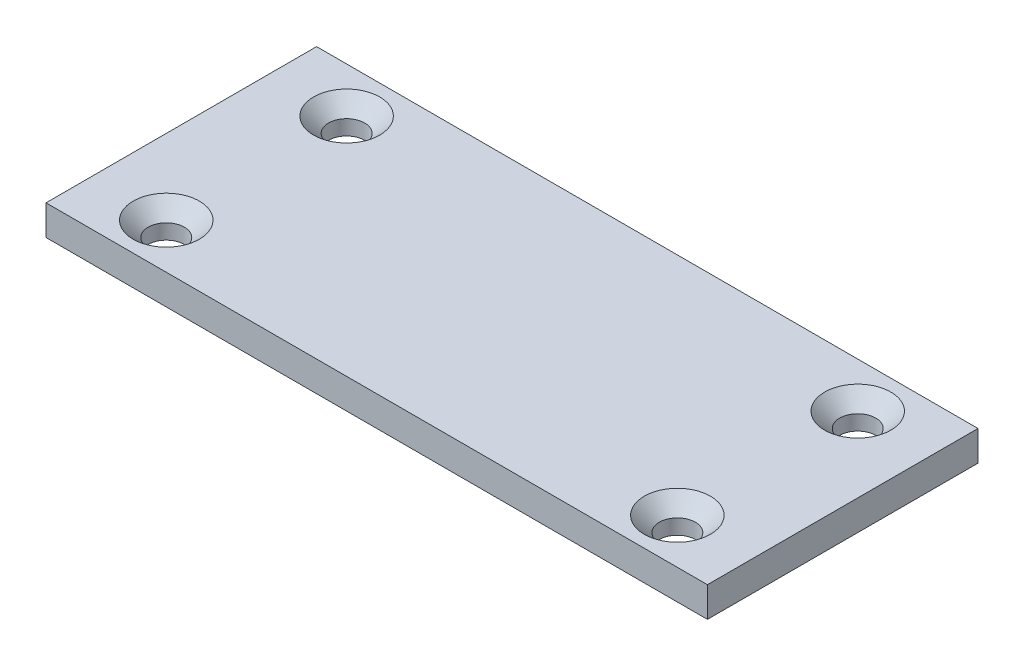
ISO-10303-21;
HEADER;
FILE_DESCRIPTION(('STEP AP214'),'2;1');
FILE_NAME('part.step','',(''),(''),'','','');
FILE_SCHEMA(('AUTOMOTIVE_DESIGN { 1 0 10303 214 1 1 1 1 }'));
ENDSEC;
DATA;
#1=APPLICATION_CONTEXT('core data for automotive mechanical design processes');
#2=APPLICATION_PROTOCOL_DEFINITION('international standard','automotive_design',2000,#1);
#3=PRODUCT_CONTEXT('',#1,'mechanical');
#4=PRODUCT('Part','Part','',(#3));
#5=PRODUCT_RELATED_PRODUCT_CATEGORY('part','',(#4));
#6=PRODUCT_DEFINITION_FORMATION('','',#4);
#7=PRODUCT_DEFINITION_CONTEXT('part definition',#1,'design');
#8=PRODUCT_DEFINITION('design','',#6,#7);
#9=PRODUCT_DEFINITION_SHAPE('','',#8);
#10=(LENGTH_UNIT() NAMED_UNIT(*) SI_UNIT(.MILLI.,.METRE.));
#11=(NAMED_UNIT(*) PLANE_ANGLE_UNIT() SI_UNIT($,.RADIAN.));
#12=(NAMED_UNIT(*) SI_UNIT($,.STERADIAN.) SOLID_ANGLE_UNIT());
#13=UNCERTAINTY_MEASURE_WITH_UNIT(LENGTH_MEASURE(1.E-05),#10,'distance_accuracy_value','');
#14=(GEOMETRIC_REPRESENTATION_CONTEXT(3) GLOBAL_UNCERTAINTY_ASSIGNED_CONTEXT((#13)) GLOBAL_UNIT_ASSIGNED_CONTEXT((#10,
#11,#12)) REPRESENTATION_CONTEXT('',''));
#15=CARTESIAN_POINT('',(0.,0.,0.));
#16=DIRECTION('',(0.,0.,1.));
#17=DIRECTION('',(1.,0.,0.));
#18=AXIS2_PLACEMENT_3D('',#15,#16,#17);
#19=CARTESIAN_POINT('',(22.,2.,9.));
#20=DIRECTION('',(-1.,0.,0.));
#21=DIRECTION('',(0.,0.,1.));
#22=AXIS2_PLACEMENT_3D('',#19,#20,#21);
#23=PLANE('',#22);
#24=DIRECTION('',(0.,0.,-1.));
#25=VECTOR('',#24,1.);
#26=CARTESIAN_POINT('',(22.,0.,9.));
#27=LINE('',#26,#25);
#28=CARTESIAN_POINT('',(22.,0.,9.));
#29=VERTEX_POINT('',#28);
#30=CARTESIAN_POINT('',(22.,0.,-9.));
#31=VERTEX_POINT('',#30);
#32=EDGE_CURVE('E105',#29,#31,#27,.T.);
#33=ORIENTED_EDGE('',*,*,#32,.T.);
#34=DIRECTION('',(0.,-1.,0.));
#35=VECTOR('',#34,1.);
#36=CARTESIAN_POINT('',(22.,2.,-9.));
#37=LINE('',#36,#35);
#38=CARTESIAN_POINT('',(22.,2.,-9.));
#39=VERTEX_POINT('',#38);
#40=EDGE_CURVE('E11',#39,#31,#37,.T.);
#41=ORIENTED_EDGE('',*,*,#40,.F.);
#42=DIRECTION('',(0.,0.,-1.));
#43=VECTOR('',#42,1.);
#44=CARTESIAN_POINT('',(22.,2.,9.));
#45=LINE('',#44,#43);
#46=CARTESIAN_POINT('',(22.,2.,9.));
#47=VERTEX_POINT('',#46);
#48=EDGE_CURVE('E92',#47,#39,#45,.T.);
#49=ORIENTED_EDGE('',*,*,#48,.F.);
#50=DIRECTION('',(0.,-1.,0.));
#51=VECTOR('',#50,1.);
#52=CARTESIAN_POINT('',(22.,2.,9.));
#53=LINE('',#52,#51);
#54=EDGE_CURVE('E101',#47,#29,#53,.T.);
#55=ORIENTED_EDGE('',*,*,#54,.T.);
#56=EDGE_LOOP('',(#33,#41,#49,#55));
#57=FACE_BOUND('',#56,.T.);
#58=ADVANCED_FACE('F39',(#57),#23,.F.);
#59=CARTESIAN_POINT('',(-22.,2.,-9.));
#60=DIRECTION('',(0.,0.,1.));
#61=DIRECTION('',(1.,0.,0.));
#62=AXIS2_PLACEMENT_3D('',#59,#60,#61);
#63=PLANE('',#62);
#64=DIRECTION('',(-1.,0.,0.));
#65=VECTOR('',#64,1.);
#66=CARTESIAN_POINT('',(-22.,0.,-9.));
#67=LINE('',#66,#65);
#68=CARTESIAN_POINT('',(-22.,0.,-9.));
#69=VERTEX_POINT('',#68);
#70=EDGE_CURVE('E96',#31,#69,#67,.T.);
#71=ORIENTED_EDGE('',*,*,#70,.T.);
#72=DIRECTION('',(0.,-1.,0.));
#73=VECTOR('',#72,1.);
#74=CARTESIAN_POINT('',(-22.,2.,-9.));
#75=LINE('',#74,#73);
#76=CARTESIAN_POINT('',(-22.,2.,-9.));
#77=VERTEX_POINT('',#76);
#78=EDGE_CURVE('E48',#77,#69,#75,.T.);
#79=ORIENTED_EDGE('',*,*,#78,.F.);
#80=DIRECTION('',(-1.,0.,0.));
#81=VECTOR('',#80,1.);
#82=CARTESIAN_POINT('',(-22.,2.,-9.));
#83=LINE('',#82,#81);
#84=EDGE_CURVE('E87',#39,#77,#83,.T.);
#85=ORIENTED_EDGE('',*,*,#84,.F.);
#86=ORIENTED_EDGE('',*,*,#40,.T.);
#87=EDGE_LOOP('',(#71,#79,#85,#86));
#88=FACE_BOUND('',#87,.T.);
#89=ADVANCED_FACE('F95',(#88),#63,.F.);
#90=CARTESIAN_POINT('',(-22.,2.,9.));
#91=DIRECTION('',(1.,0.,0.));
#92=DIRECTION('',(0.,0.,-1.));
#93=AXIS2_PLACEMENT_3D('',#90,#91,#92);
#94=PLANE('',#93);
#95=DIRECTION('',(0.,0.,1.));
#96=VECTOR('',#95,1.);
#97=CARTESIAN_POINT('',(-22.,0.,9.));
#98=LINE('',#97,#96);
#99=CARTESIAN_POINT('',(-22.,0.,9.));
#100=VERTEX_POINT('',#99);
#101=EDGE_CURVE('E74',#69,#100,#98,.T.);
#102=ORIENTED_EDGE('',*,*,#101,.T.);
#103=DIRECTION('',(0.,-1.,0.));
#104=VECTOR('',#103,1.);
#105=CARTESIAN_POINT('',(-22.,2.,9.));
#106=LINE('',#105,#104);
#107=CARTESIAN_POINT('',(-22.,2.,9.));
#108=VERTEX_POINT('',#107);
#109=EDGE_CURVE('E97',#108,#100,#106,.T.);
#110=ORIENTED_EDGE('',*,*,#109,.F.);
#111=DIRECTION('',(0.,0.,1.));
#112=VECTOR('',#111,1.);
#113=CARTESIAN_POINT('',(-22.,2.,9.));
#114=LINE('',#113,#112);
#115=EDGE_CURVE('E90',#77,#108,#114,.T.);
#116=ORIENTED_EDGE('',*,*,#115,.F.);
#117=ORIENTED_EDGE('',*,*,#78,.T.);
#118=EDGE_LOOP('',(#102,#110,#116,#117));
#119=FACE_BOUND('',#118,.T.);
#120=ADVANCED_FACE('F99',(#119),#94,.F.);
#121=CARTESIAN_POINT('',(-22.,2.,9.));
#122=DIRECTION('',(0.,0.,-1.));
#123=DIRECTION('',(-1.,0.,0.));
#124=AXIS2_PLACEMENT_3D('',#121,#122,#123);
#125=PLANE('',#124);
#126=DIRECTION('',(1.,0.,0.));
#127=VECTOR('',#126,1.);
#128=CARTESIAN_POINT('',(-22.,0.,9.));
#129=LINE('',#128,#127);
#130=EDGE_CURVE('E80',#100,#29,#129,.T.);
#131=ORIENTED_EDGE('',*,*,#130,.T.);
#132=ORIENTED_EDGE('',*,*,#54,.F.);
#133=DIRECTION('',(1.,0.,0.));
#134=VECTOR('',#133,1.);
#135=CARTESIAN_POINT('',(-22.,2.,9.));
#136=LINE('',#135,#134);
#137=EDGE_CURVE('E57',#108,#47,#136,.T.);
#138=ORIENTED_EDGE('',*,*,#137,.F.);
#139=ORIENTED_EDGE('',*,*,#109,.T.);
#140=EDGE_LOOP('',(#131,#132,#138,#139));
#141=FACE_BOUND('',#140,.T.);
#142=ADVANCED_FACE('F156',(#141),#125,.F.);
#143=CARTESIAN_POINT('',(0.,2.,0.));
#144=DIRECTION('',(0.,-1.,0.));
#145=DIRECTION('',(0.,0.,-1.));
#146=AXIS2_PLACEMENT_3D('',#143,#144,#145);
#147=PLANE('',#146);
#148=CARTESIAN_POINT('',(-17.,2.,-6.));
#149=DIRECTION('',(0.,1.,0.));
#150=DIRECTION('',(0.,0.,1.));
#151=AXIS2_PLACEMENT_3D('',#148,#149,#150);
#152=CIRCLE('',#151,2.2);
#153=CARTESIAN_POINT('',(-17.,2.,-3.8));
#154=VERTEX_POINT('',#153);
#155=EDGE_CURVE('E278',#154,#154,#152,.T.);
#156=ORIENTED_EDGE('',*,*,#155,.F.);
#157=EDGE_LOOP('',(#156));
#158=FACE_BOUND('',#157,.T.);
#159=CARTESIAN_POINT('',(17.,2.,-6.));
#160=DIRECTION('',(0.,1.,0.));
#161=DIRECTION('',(0.,0.,1.));
#162=AXIS2_PLACEMENT_3D('',#159,#160,#161);
#163=CIRCLE('',#162,2.2);
#164=CARTESIAN_POINT('',(17.,2.,-3.8));
#165=VERTEX_POINT('',#164);
#166=EDGE_CURVE('E130',#165,#165,#163,.T.);
#167=ORIENTED_EDGE('',*,*,#166,.F.);
#168=EDGE_LOOP('',(#167));
#169=FACE_BOUND('',#168,.T.);
#170=CARTESIAN_POINT('',(-17.,2.,6.));
#171=DIRECTION('',(0.,1.,0.));
#172=DIRECTION('',(0.,0.,1.));
#173=AXIS2_PLACEMENT_3D('',#170,#171,#172);
#174=CIRCLE('',#173,2.2);
#175=CARTESIAN_POINT('',(-17.,2.,8.2));
#176=VERTEX_POINT('',#175);
#177=EDGE_CURVE('E123',#176,#176,#174,.T.);
#178=ORIENTED_EDGE('',*,*,#177,.F.);
#179=EDGE_LOOP('',(#178));
#180=FACE_BOUND('',#179,.T.);
#181=CARTESIAN_POINT('',(17.,2.,6.));
#182=DIRECTION('',(0.,1.,0.));
#183=DIRECTION('',(0.,0.,1.));
#184=AXIS2_PLACEMENT_3D('',#181,#182,#183);
#185=CIRCLE('',#184,2.2);
#186=CARTESIAN_POINT('',(17.,2.,8.2));
#187=VERTEX_POINT('',#186);
#188=EDGE_CURVE('E119',#187,#187,#185,.T.);
#189=ORIENTED_EDGE('',*,*,#188,.F.);
#190=EDGE_LOOP('',(#189));
#191=FACE_BOUND('',#190,.T.);
#192=ORIENTED_EDGE('',*,*,#48,.T.);
#193=ORIENTED_EDGE('',*,*,#84,.T.);
#194=ORIENTED_EDGE('',*,*,#115,.T.);
#195=ORIENTED_EDGE('',*,*,#137,.T.);
#196=EDGE_LOOP('',(#192,#193,#194,#195));
#197=FACE_BOUND('',#196,.T.);
#198=ADVANCED_FACE('F88',(#158,#169,#180,#191,#197),#147,.F.);
#199=CARTESIAN_POINT('',(0.,0.,0.));
#200=DIRECTION('',(0.,-1.,0.));
#201=DIRECTION('',(0.,0.,-1.));
#202=AXIS2_PLACEMENT_3D('',#199,#200,#201);
#203=PLANE('',#202);
#204=CARTESIAN_POINT('',(-17.,0.,-6.));
#205=DIRECTION('',(0.,-1.,0.));
#206=DIRECTION('',(0.,0.,-1.));
#207=AXIS2_PLACEMENT_3D('',#204,#205,#206);
#208=CIRCLE('',#207,1.19999999999999);
#209=CARTESIAN_POINT('',(-17.,0.,-7.19999999999999));
#210=VERTEX_POINT('',#209);
#211=EDGE_CURVE('E42',#210,#210,#208,.T.);
#212=ORIENTED_EDGE('',*,*,#211,.F.);
#213=EDGE_LOOP('',(#212));
#214=FACE_BOUND('',#213,.T.);
#215=CARTESIAN_POINT('',(17.,0.,-6.));
#216=DIRECTION('',(0.,-1.,0.));
#217=DIRECTION('',(0.,0.,-1.));
#218=AXIS2_PLACEMENT_3D('',#215,#216,#217);
#219=CIRCLE('',#218,1.19999999999999);
#220=CARTESIAN_POINT('',(17.,0.,-7.19999999999999));
#221=VERTEX_POINT('',#220);
#222=EDGE_CURVE('E121',#221,#221,#219,.T.);
#223=ORIENTED_EDGE('',*,*,#222,.F.);
#224=EDGE_LOOP('',(#223));
#225=FACE_BOUND('',#224,.T.);
#226=CARTESIAN_POINT('',(-17.,0.,6.));
#227=DIRECTION('',(0.,-1.,0.));
#228=DIRECTION('',(0.,0.,-1.));
#229=AXIS2_PLACEMENT_3D('',#226,#227,#228);
#230=CIRCLE('',#229,1.19999999999999);
#231=CARTESIAN_POINT('',(-17.,0.,4.80000000000001));
#232=VERTEX_POINT('',#231);
#233=EDGE_CURVE('E117',#232,#232,#230,.T.);
#234=ORIENTED_EDGE('',*,*,#233,.F.);
#235=EDGE_LOOP('',(#234));
#236=FACE_BOUND('',#235,.T.);
#237=CARTESIAN_POINT('',(17.,0.,6.));
#238=DIRECTION('',(0.,-1.,0.));
#239=DIRECTION('',(0.,0.,-1.));
#240=AXIS2_PLACEMENT_3D('',#237,#238,#239);
#241=CIRCLE('',#240,1.19999999999999);
#242=CARTESIAN_POINT('',(17.,0.,4.80000000000001));
#243=VERTEX_POINT('',#242);
#244=EDGE_CURVE('E108',#243,#243,#241,.T.);
#245=ORIENTED_EDGE('',*,*,#244,.F.);
#246=EDGE_LOOP('',(#245));
#247=FACE_BOUND('',#246,.T.);
#248=ORIENTED_EDGE('',*,*,#32,.F.);
#249=ORIENTED_EDGE('',*,*,#130,.F.);
#250=ORIENTED_EDGE('',*,*,#101,.F.);
#251=ORIENTED_EDGE('',*,*,#70,.F.);
#252=EDGE_LOOP('',(#248,#249,#250,#251));
#253=FACE_BOUND('',#252,.T.);
#254=ADVANCED_FACE('F155',(#214,#225,#236,#247,#253),#203,.T.);
#255=CARTESIAN_POINT('',(17.,2.,6.));
#256=DIRECTION('',(0.,1.,0.));
#257=DIRECTION('',(0.,0.,1.));
#258=AXIS2_PLACEMENT_3D('',#255,#256,#257);
#259=CYLINDRICAL_SURFACE('',#258,1.19999999999999);
#260=ORIENTED_EDGE('',*,*,#244,.T.);
#261=EDGE_LOOP('',(#260));
#262=FACE_BOUND('',#261,.T.);
#263=CARTESIAN_POINT('',(17.,0.999999999999999,6.));
#264=DIRECTION('',(0.,1.,0.));
#265=DIRECTION('',(0.,0.,1.));
#266=AXIS2_PLACEMENT_3D('',#263,#264,#265);
#267=CIRCLE('',#266,1.2);
#268=CARTESIAN_POINT('',(17.,0.999999999999999,7.2));
#269=VERTEX_POINT('',#268);
#270=EDGE_CURVE('E116',#269,#269,#267,.T.);
#271=ORIENTED_EDGE('',*,*,#270,.T.);
#272=EDGE_LOOP('',(#271));
#273=FACE_BOUND('',#272,.T.);
#274=ADVANCED_FACE('F145',(#262,#273),#259,.F.);
#275=CARTESIAN_POINT('',(17.,2.,6.));
#276=DIRECTION('',(0.,1.,0.));
#277=DIRECTION('',(0.,0.,1.));
#278=AXIS2_PLACEMENT_3D('',#275,#276,#277);
#279=CONICAL_SURFACE('',#278,2.2,0.785398163397447);
#280=ORIENTED_EDGE('',*,*,#270,.F.);
#281=EDGE_LOOP('',(#280));
#282=FACE_BOUND('',#281,.T.);
#283=ORIENTED_EDGE('',*,*,#188,.T.);
#284=EDGE_LOOP('',(#283));
#285=FACE_BOUND('',#284,.T.);
#286=ADVANCED_FACE('F147',(#282,#285),#279,.F.);
#287=CARTESIAN_POINT('',(-17.,2.,6.));
#288=DIRECTION('',(0.,1.,0.));
#289=DIRECTION('',(0.,0.,1.));
#290=AXIS2_PLACEMENT_3D('',#287,#288,#289);
#291=CYLINDRICAL_SURFACE('',#290,1.19999999999999);
#292=ORIENTED_EDGE('',*,*,#233,.T.);
#293=EDGE_LOOP('',(#292));
#294=FACE_BOUND('',#293,.T.);
#295=CARTESIAN_POINT('',(-17.,0.999999999999999,6.));
#296=DIRECTION('',(0.,1.,0.));
#297=DIRECTION('',(0.,0.,1.));
#298=AXIS2_PLACEMENT_3D('',#295,#296,#297);
#299=CIRCLE('',#298,1.2);
#300=CARTESIAN_POINT('',(-17.,0.999999999999999,7.2));
#301=VERTEX_POINT('',#300);
#302=EDGE_CURVE('E120',#301,#301,#299,.T.);
#303=ORIENTED_EDGE('',*,*,#302,.T.);
#304=EDGE_LOOP('',(#303));
#305=FACE_BOUND('',#304,.T.);
#306=ADVANCED_FACE('F150',(#294,#305),#291,.F.);
#307=CARTESIAN_POINT('',(-17.,2.,6.));
#308=DIRECTION('',(0.,1.,0.));
#309=DIRECTION('',(0.,0.,1.));
#310=AXIS2_PLACEMENT_3D('',#307,#308,#309);
#311=CONICAL_SURFACE('',#310,2.2,0.785398163397447);
#312=ORIENTED_EDGE('',*,*,#302,.F.);
#313=EDGE_LOOP('',(#312));
#314=FACE_BOUND('',#313,.T.);
#315=ORIENTED_EDGE('',*,*,#177,.T.);
#316=EDGE_LOOP('',(#315));
#317=FACE_BOUND('',#316,.T.);
#318=ADVANCED_FACE('F221',(#314,#317),#311,.F.);
#319=CARTESIAN_POINT('',(17.,2.,-6.));
#320=DIRECTION('',(0.,1.,0.));
#321=DIRECTION('',(0.,0.,1.));
#322=AXIS2_PLACEMENT_3D('',#319,#320,#321);
#323=CYLINDRICAL_SURFACE('',#322,1.19999999999999);
#324=ORIENTED_EDGE('',*,*,#222,.T.);
#325=EDGE_LOOP('',(#324));
#326=FACE_BOUND('',#325,.T.);
#327=CARTESIAN_POINT('',(17.,0.999999999999999,-6.));
#328=DIRECTION('',(0.,1.,0.));
#329=DIRECTION('',(0.,0.,1.));
#330=AXIS2_PLACEMENT_3D('',#327,#328,#329);
#331=CIRCLE('',#330,1.2);
#332=CARTESIAN_POINT('',(17.,0.999999999999999,-4.8));
#333=VERTEX_POINT('',#332);
#334=EDGE_CURVE('E124',#333,#333,#331,.T.);
#335=ORIENTED_EDGE('',*,*,#334,.T.);
#336=EDGE_LOOP('',(#335));
#337=FACE_BOUND('',#336,.T.);
#338=ADVANCED_FACE('F231',(#326,#337),#323,.F.);
#339=CARTESIAN_POINT('',(17.,2.,-6.));
#340=DIRECTION('',(0.,1.,0.));
#341=DIRECTION('',(0.,0.,1.));
#342=AXIS2_PLACEMENT_3D('',#339,#340,#341);
#343=CONICAL_SURFACE('',#342,2.2,0.785398163397447);
#344=ORIENTED_EDGE('',*,*,#334,.F.);
#345=EDGE_LOOP('',(#344));
#346=FACE_BOUND('',#345,.T.);
#347=ORIENTED_EDGE('',*,*,#166,.T.);
#348=EDGE_LOOP('',(#347));
#349=FACE_BOUND('',#348,.T.);
#350=ADVANCED_FACE('F241',(#346,#349),#343,.F.);
#351=CARTESIAN_POINT('',(-17.,2.,-6.));
#352=DIRECTION('',(0.,1.,0.));
#353=DIRECTION('',(0.,0.,1.));
#354=AXIS2_PLACEMENT_3D('',#351,#352,#353);
#355=CYLINDRICAL_SURFACE('',#354,1.19999999999999);
#356=ORIENTED_EDGE('',*,*,#211,.T.);
#357=EDGE_LOOP('',(#356));
#358=FACE_BOUND('',#357,.T.);
#359=CARTESIAN_POINT('',(-17.,0.999999999999999,-6.));
#360=DIRECTION('',(0.,1.,0.));
#361=DIRECTION('',(0.,0.,1.));
#362=AXIS2_PLACEMENT_3D('',#359,#360,#361);
#363=CIRCLE('',#362,1.2);
#364=CARTESIAN_POINT('',(-17.,0.999999999999999,-4.8));
#365=VERTEX_POINT('',#364);
#366=EDGE_CURVE('E276',#365,#365,#363,.T.);
#367=ORIENTED_EDGE('',*,*,#366,.T.);
#368=EDGE_LOOP('',(#367));
#369=FACE_BOUND('',#368,.T.);
#370=ADVANCED_FACE('F250',(#358,#369),#355,.F.);
#371=CARTESIAN_POINT('',(-17.,2.,-6.));
#372=DIRECTION('',(0.,1.,0.));
#373=DIRECTION('',(0.,0.,1.));
#374=AXIS2_PLACEMENT_3D('',#371,#372,#373);
#375=CONICAL_SURFACE('',#374,2.2,0.785398163397447);
#376=ORIENTED_EDGE('',*,*,#366,.F.);
#377=EDGE_LOOP('',(#376));
#378=FACE_BOUND('',#377,.T.);
#379=ORIENTED_EDGE('',*,*,#155,.T.);
#380=EDGE_LOOP('',(#379));
#381=FACE_BOUND('',#380,.T.);
#382=ADVANCED_FACE('F260',(#378,#381),#375,.F.);
#383=CLOSED_SHELL('',(#58,#89,#120,#142,#198,#254,#274,#286,#306,#318,#338,#350,#370,#382));
#384=MANIFOLD_SOLID_BREP('B2',#383);
#385=ADVANCED_BREP_SHAPE_REPRESENTATION('',(#18,#384),#14);
#386=SHAPE_DEFINITION_REPRESENTATION(#9,#385);
ENDSEC;
END-ISO-10303-21;
